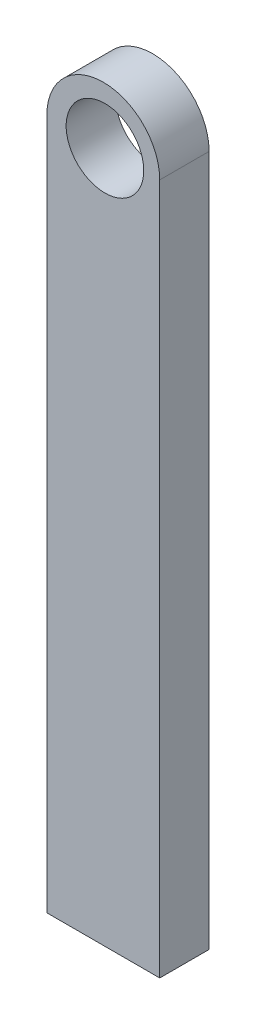
ISO-10303-21;
HEADER;
FILE_DESCRIPTION(('STEP AP214'),'2;1');
FILE_NAME('part.step','',(''),(''),'','','');
FILE_SCHEMA(('AUTOMOTIVE_DESIGN { 1 0 10303 214 1 1 1 1 }'));
ENDSEC;
DATA;
#1=APPLICATION_CONTEXT('core data for automotive mechanical design processes');
#2=APPLICATION_PROTOCOL_DEFINITION('international standard','automotive_design',2000,#1);
#3=PRODUCT_CONTEXT('',#1,'mechanical');
#4=PRODUCT('Part','Part','',(#3));
#5=PRODUCT_RELATED_PRODUCT_CATEGORY('part','',(#4));
#6=PRODUCT_DEFINITION_FORMATION('','',#4);
#7=PRODUCT_DEFINITION_CONTEXT('part definition',#1,'design');
#8=PRODUCT_DEFINITION('design','',#6,#7);
#9=PRODUCT_DEFINITION_SHAPE('','',#8);
#10=(LENGTH_UNIT() NAMED_UNIT(*) SI_UNIT(.MILLI.,.METRE.));
#11=(NAMED_UNIT(*) PLANE_ANGLE_UNIT() SI_UNIT($,.RADIAN.));
#12=(NAMED_UNIT(*) SI_UNIT($,.STERADIAN.) SOLID_ANGLE_UNIT());
#13=UNCERTAINTY_MEASURE_WITH_UNIT(LENGTH_MEASURE(1.E-05),#10,'distance_accuracy_value','');
#14=(GEOMETRIC_REPRESENTATION_CONTEXT(3) GLOBAL_UNCERTAINTY_ASSIGNED_CONTEXT((#13)) GLOBAL_UNIT_ASSIGNED_CONTEXT((#10,
#11,#12)) REPRESENTATION_CONTEXT('',''));
#15=CARTESIAN_POINT('',(0.,0.,0.));
#16=DIRECTION('',(0.,0.,1.));
#17=DIRECTION('',(1.,0.,0.));
#18=AXIS2_PLACEMENT_3D('',#15,#16,#17);
#19=CARTESIAN_POINT('',(-4.51544473013422,33.3520627247032,11.1125));
#20=DIRECTION('',(0.,0.,-1.));
#21=DIRECTION('',(-1.,0.,0.));
#22=AXIS2_PLACEMENT_3D('',#19,#20,#21);
#23=CYLINDRICAL_SURFACE('',#22,12.7);
#24=CARTESIAN_POINT('',(-4.51544473013422,33.3520627247032,0.));
#25=DIRECTION('',(0.,0.,-1.));
#26=DIRECTION('',(-1.,0.,0.));
#27=AXIS2_PLACEMENT_3D('',#24,#25,#26);
#28=CIRCLE('',#27,12.7);
#29=CARTESIAN_POINT('',(-17.2154447301342,33.3520627247032,0.));
#30=VERTEX_POINT('',#29);
#31=CARTESIAN_POINT('',(8.18455526986578,33.3520627247032,0.));
#32=VERTEX_POINT('',#31);
#33=EDGE_CURVE('E99',#30,#32,#28,.T.);
#34=ORIENTED_EDGE('',*,*,#33,.F.);
#35=DIRECTION('',(0.,0.,-1.));
#36=VECTOR('',#35,1.);
#37=CARTESIAN_POINT('',(-17.2154447301342,33.3520627247032,11.1125));
#38=LINE('',#37,#36);
#39=CARTESIAN_POINT('',(-17.2154447301342,33.3520627247032,11.1125));
#40=VERTEX_POINT('',#39);
#41=EDGE_CURVE('E11',#40,#30,#38,.T.);
#42=ORIENTED_EDGE('',*,*,#41,.F.);
#43=CARTESIAN_POINT('',(-4.51544473013422,33.3520627247032,11.1125));
#44=DIRECTION('',(0.,0.,-1.));
#45=DIRECTION('',(-1.,0.,0.));
#46=AXIS2_PLACEMENT_3D('',#43,#44,#45);
#47=CIRCLE('',#46,12.7);
#48=CARTESIAN_POINT('',(8.18455526986578,33.3520627247032,11.1125));
#49=VERTEX_POINT('',#48);
#50=EDGE_CURVE('E93',#40,#49,#47,.T.);
#51=ORIENTED_EDGE('',*,*,#50,.T.);
#52=DIRECTION('',(0.,0.,-1.));
#53=VECTOR('',#52,1.);
#54=CARTESIAN_POINT('',(8.18455526986578,33.3520627247032,11.1125));
#55=LINE('',#54,#53);
#56=EDGE_CURVE('E36',#49,#32,#55,.T.);
#57=ORIENTED_EDGE('',*,*,#56,.T.);
#58=EDGE_LOOP('',(#34,#42,#51,#57));
#59=FACE_BOUND('',#58,.T.);
#60=ADVANCED_FACE('F33',(#59),#23,.T.);
#61=CARTESIAN_POINT('',(-17.2154447301342,33.3520627247032,11.1125));
#62=DIRECTION('',(1.,0.,0.));
#63=DIRECTION('',(0.,1.,0.));
#64=AXIS2_PLACEMENT_3D('',#61,#62,#63);
#65=PLANE('',#64);
#66=DIRECTION('',(0.,-1.,0.));
#67=VECTOR('',#66,1.);
#68=CARTESIAN_POINT('',(-17.2154447301342,33.3520627247032,0.));
#69=LINE('',#68,#67);
#70=CARTESIAN_POINT('',(-17.2154447301342,-122.222937275297,0.));
#71=VERTEX_POINT('',#70);
#72=EDGE_CURVE('E66',#30,#71,#69,.T.);
#73=ORIENTED_EDGE('',*,*,#72,.T.);
#74=DIRECTION('',(0.,0.,-1.));
#75=VECTOR('',#74,1.);
#76=CARTESIAN_POINT('',(-17.2154447301342,-122.222937275297,11.1125));
#77=LINE('',#76,#75);
#78=CARTESIAN_POINT('',(-17.2154447301342,-122.222937275297,11.1125));
#79=VERTEX_POINT('',#78);
#80=EDGE_CURVE('E42',#79,#71,#77,.T.);
#81=ORIENTED_EDGE('',*,*,#80,.F.);
#82=DIRECTION('',(0.,-1.,0.));
#83=VECTOR('',#82,1.);
#84=CARTESIAN_POINT('',(-17.2154447301342,33.3520627247032,11.1125));
#85=LINE('',#84,#83);
#86=EDGE_CURVE('E83',#40,#79,#85,.T.);
#87=ORIENTED_EDGE('',*,*,#86,.F.);
#88=ORIENTED_EDGE('',*,*,#41,.T.);
#89=EDGE_LOOP('',(#73,#81,#87,#88));
#90=FACE_BOUND('',#89,.T.);
#91=ADVANCED_FACE('F110',(#90),#65,.F.);
#92=CARTESIAN_POINT('',(-17.2154447301342,-122.222937275297,11.1125));
#93=DIRECTION('',(0.,1.,0.));
#94=DIRECTION('',(0.,0.,1.));
#95=AXIS2_PLACEMENT_3D('',#92,#93,#94);
#96=PLANE('',#95);
#97=DIRECTION('',(1.,0.,0.));
#98=VECTOR('',#97,1.);
#99=CARTESIAN_POINT('',(-17.2154447301342,-122.222937275297,0.));
#100=LINE('',#99,#98);
#101=CARTESIAN_POINT('',(8.1845552698658,-122.222937275297,0.));
#102=VERTEX_POINT('',#101);
#103=EDGE_CURVE('E90',#71,#102,#100,.T.);
#104=ORIENTED_EDGE('',*,*,#103,.T.);
#105=DIRECTION('',(0.,0.,-1.));
#106=VECTOR('',#105,1.);
#107=CARTESIAN_POINT('',(8.1845552698658,-122.222937275297,11.1125));
#108=LINE('',#107,#106);
#109=CARTESIAN_POINT('',(8.1845552698658,-122.222937275297,11.1125));
#110=VERTEX_POINT('',#109);
#111=EDGE_CURVE('E87',#110,#102,#108,.T.);
#112=ORIENTED_EDGE('',*,*,#111,.F.);
#113=DIRECTION('',(1.,0.,0.));
#114=VECTOR('',#113,1.);
#115=CARTESIAN_POINT('',(-17.2154447301342,-122.222937275297,11.1125));
#116=LINE('',#115,#114);
#117=EDGE_CURVE('E78',#79,#110,#116,.T.);
#118=ORIENTED_EDGE('',*,*,#117,.F.);
#119=ORIENTED_EDGE('',*,*,#80,.T.);
#120=EDGE_LOOP('',(#104,#112,#118,#119));
#121=FACE_BOUND('',#120,.T.);
#122=ADVANCED_FACE('F88',(#121),#96,.F.);
#123=CARTESIAN_POINT('',(8.18455526986578,33.3520627247032,11.1125));
#124=DIRECTION('',(1.,0.,0.));
#125=DIRECTION('',(0.,1.,0.));
#126=AXIS2_PLACEMENT_3D('',#123,#124,#125);
#127=PLANE('',#126);
#128=DIRECTION('',(0.,-1.,0.));
#129=VECTOR('',#128,1.);
#130=CARTESIAN_POINT('',(8.18455526986578,33.3520627247032,0.));
#131=LINE('',#130,#129);
#132=EDGE_CURVE('E102',#32,#102,#131,.T.);
#133=ORIENTED_EDGE('',*,*,#132,.F.);
#134=ORIENTED_EDGE('',*,*,#56,.F.);
#135=DIRECTION('',(0.,-1.,0.));
#136=VECTOR('',#135,1.);
#137=CARTESIAN_POINT('',(8.18455526986578,33.3520627247032,11.1125));
#138=LINE('',#137,#136);
#139=EDGE_CURVE('E82',#49,#110,#138,.T.);
#140=ORIENTED_EDGE('',*,*,#139,.T.);
#141=ORIENTED_EDGE('',*,*,#111,.T.);
#142=EDGE_LOOP('',(#133,#134,#140,#141));
#143=FACE_BOUND('',#142,.T.);
#144=ADVANCED_FACE('F92',(#143),#127,.T.);
#145=CARTESIAN_POINT('',(-4.51544473013422,33.3520627247032,11.1125));
#146=DIRECTION('',(0.,0.,-1.));
#147=DIRECTION('',(-1.,0.,0.));
#148=AXIS2_PLACEMENT_3D('',#145,#146,#147);
#149=PLANE('',#148);
#150=CARTESIAN_POINT('',(-4.14740544447004,33.3573966367666,11.1125));
#151=DIRECTION('',(0.,0.,1.));
#152=DIRECTION('',(1.,0.,0.));
#153=AXIS2_PLACEMENT_3D('',#150,#151,#152);
#154=CIRCLE('',#153,8.73125);
#155=CARTESIAN_POINT('',(4.58384455552995,33.3573966367666,11.1125));
#156=VERTEX_POINT('',#155);
#157=EDGE_CURVE('E141',#156,#156,#154,.T.);
#158=ORIENTED_EDGE('',*,*,#157,.F.);
#159=EDGE_LOOP('',(#158));
#160=FACE_BOUND('',#159,.T.);
#161=ORIENTED_EDGE('',*,*,#50,.F.);
#162=ORIENTED_EDGE('',*,*,#86,.T.);
#163=ORIENTED_EDGE('',*,*,#117,.T.);
#164=ORIENTED_EDGE('',*,*,#139,.F.);
#165=EDGE_LOOP('',(#161,#162,#163,#164));
#166=FACE_BOUND('',#165,.T.);
#167=ADVANCED_FACE('F81',(#160,#166),#149,.F.);
#168=CARTESIAN_POINT('',(-4.51544473013422,33.3520627247032,0.));
#169=DIRECTION('',(0.,0.,-1.));
#170=DIRECTION('',(-1.,0.,0.));
#171=AXIS2_PLACEMENT_3D('',#168,#169,#170);
#172=PLANE('',#171);
#173=CARTESIAN_POINT('',(-4.14740544447004,33.3573966367666,0.));
#174=DIRECTION('',(0.,0.,1.));
#175=DIRECTION('',(1.,0.,0.));
#176=AXIS2_PLACEMENT_3D('',#173,#174,#175);
#177=CIRCLE('',#176,8.73125);
#178=CARTESIAN_POINT('',(4.58384455552995,33.3573966367666,0.));
#179=VERTEX_POINT('',#178);
#180=EDGE_CURVE('E103',#179,#179,#177,.T.);
#181=ORIENTED_EDGE('',*,*,#180,.T.);
#182=EDGE_LOOP('',(#181));
#183=FACE_BOUND('',#182,.T.);
#184=ORIENTED_EDGE('',*,*,#33,.T.);
#185=ORIENTED_EDGE('',*,*,#132,.T.);
#186=ORIENTED_EDGE('',*,*,#103,.F.);
#187=ORIENTED_EDGE('',*,*,#72,.F.);
#188=EDGE_LOOP('',(#184,#185,#186,#187));
#189=FACE_BOUND('',#188,.T.);
#190=ADVANCED_FACE('F108',(#183,#189),#172,.T.);
#191=CARTESIAN_POINT('',(-4.14740544447004,33.3573966367666,0.));
#192=DIRECTION('',(0.,0.,1.));
#193=DIRECTION('',(1.,0.,0.));
#194=AXIS2_PLACEMENT_3D('',#191,#192,#193);
#195=CYLINDRICAL_SURFACE('',#194,8.73125);
#196=ORIENTED_EDGE('',*,*,#180,.F.);
#197=EDGE_LOOP('',(#196));
#198=FACE_BOUND('',#197,.T.);
#199=ORIENTED_EDGE('',*,*,#157,.T.);
#200=EDGE_LOOP('',(#199));
#201=FACE_BOUND('',#200,.T.);
#202=ADVANCED_FACE('F129',(#198,#201),#195,.F.);
#203=CLOSED_SHELL('',(#60,#91,#122,#144,#167,#190,#202));
#204=MANIFOLD_SOLID_BREP('B2',#203);
#205=ADVANCED_BREP_SHAPE_REPRESENTATION('',(#18,#204),#14);
#206=SHAPE_DEFINITION_REPRESENTATION(#9,#205);
ENDSEC;
END-ISO-10303-21;
